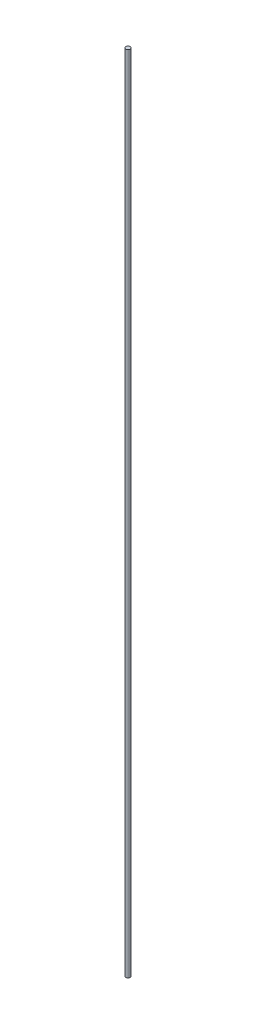
ISO-10303-21;
HEADER;
FILE_DESCRIPTION(('STEP AP214'),'2;1');
FILE_NAME('part.step','',(''),(''),'','','');
FILE_SCHEMA(('AUTOMOTIVE_DESIGN { 1 0 10303 214 1 1 1 1 }'));
ENDSEC;
DATA;
#1=APPLICATION_CONTEXT('core data for automotive mechanical design processes');
#2=APPLICATION_PROTOCOL_DEFINITION('international standard','automotive_design',2000,#1);
#3=PRODUCT_CONTEXT('',#1,'mechanical');
#4=PRODUCT('Part','Part','',(#3));
#5=PRODUCT_RELATED_PRODUCT_CATEGORY('part','',(#4));
#6=PRODUCT_DEFINITION_FORMATION('','',#4);
#7=PRODUCT_DEFINITION_CONTEXT('part definition',#1,'design');
#8=PRODUCT_DEFINITION('design','',#6,#7);
#9=PRODUCT_DEFINITION_SHAPE('','',#8);
#10=(LENGTH_UNIT() NAMED_UNIT(*) SI_UNIT(.MILLI.,.METRE.));
#11=(NAMED_UNIT(*) PLANE_ANGLE_UNIT() SI_UNIT($,.RADIAN.));
#12=(NAMED_UNIT(*) SI_UNIT($,.STERADIAN.) SOLID_ANGLE_UNIT());
#13=UNCERTAINTY_MEASURE_WITH_UNIT(LENGTH_MEASURE(1.E-05),#10,'distance_accuracy_value','');
#14=(GEOMETRIC_REPRESENTATION_CONTEXT(3) GLOBAL_UNCERTAINTY_ASSIGNED_CONTEXT((#13)) GLOBAL_UNIT_ASSIGNED_CONTEXT((#10,
#11,#12)) REPRESENTATION_CONTEXT('',''));
#15=CARTESIAN_POINT('',(0.,0.,0.));
#16=DIRECTION('',(0.,0.,1.));
#17=DIRECTION('',(1.,0.,0.));
#18=AXIS2_PLACEMENT_3D('',#15,#16,#17);
#19=CARTESIAN_POINT('',(0.,180.,0.));
#20=DIRECTION('',(0.,-1.,0.));
#21=DIRECTION('',(0.,0.,-1.));
#22=AXIS2_PLACEMENT_3D('',#19,#20,#21);
#23=CYLINDRICAL_SURFACE('',#22,0.5);
#24=CARTESIAN_POINT('',(0.,180.,0.));
#25=DIRECTION('',(0.,1.,0.));
#26=DIRECTION('',(0.,0.,1.));
#27=AXIS2_PLACEMENT_3D('',#24,#25,#26);
#28=CIRCLE('',#27,0.5);
#29=CARTESIAN_POINT('',(0.,180.,0.5));
#30=VERTEX_POINT('',#29);
#31=EDGE_CURVE('E10',#30,#30,#28,.T.);
#32=ORIENTED_EDGE('',*,*,#31,.F.);
#33=EDGE_LOOP('',(#32));
#34=FACE_BOUND('',#33,.T.);
#35=CARTESIAN_POINT('',(0.,0.,0.));
#36=DIRECTION('',(0.,1.,0.));
#37=DIRECTION('',(0.,0.,1.));
#38=AXIS2_PLACEMENT_3D('',#35,#36,#37);
#39=CIRCLE('',#38,0.5);
#40=CARTESIAN_POINT('',(0.,0.,0.5));
#41=VERTEX_POINT('',#40);
#42=EDGE_CURVE('E34',#41,#41,#39,.T.);
#43=ORIENTED_EDGE('',*,*,#42,.T.);
#44=EDGE_LOOP('',(#43));
#45=FACE_BOUND('',#44,.T.);
#46=ADVANCED_FACE('F31',(#34,#45),#23,.T.);
#47=CARTESIAN_POINT('',(0.,180.,0.));
#48=DIRECTION('',(0.,1.,0.));
#49=DIRECTION('',(0.,0.,1.));
#50=AXIS2_PLACEMENT_3D('',#47,#48,#49);
#51=PLANE('',#50);
#52=ORIENTED_EDGE('',*,*,#31,.T.);
#53=EDGE_LOOP('',(#52));
#54=FACE_BOUND('',#53,.T.);
#55=ADVANCED_FACE('F46',(#54),#51,.T.);
#56=CARTESIAN_POINT('',(0.,0.,0.));
#57=DIRECTION('',(0.,1.,0.));
#58=DIRECTION('',(0.,0.,1.));
#59=AXIS2_PLACEMENT_3D('',#56,#57,#58);
#60=PLANE('',#59);
#61=ORIENTED_EDGE('',*,*,#42,.F.);
#62=EDGE_LOOP('',(#61));
#63=FACE_BOUND('',#62,.T.);
#64=ADVANCED_FACE('F44',(#63),#60,.F.);
#65=CLOSED_SHELL('',(#46,#55,#64));
#66=MANIFOLD_SOLID_BREP('B2',#65);
#67=ADVANCED_BREP_SHAPE_REPRESENTATION('',(#18,#66),#14);
#68=SHAPE_DEFINITION_REPRESENTATION(#9,#67);
ENDSEC;
END-ISO-10303-21;
